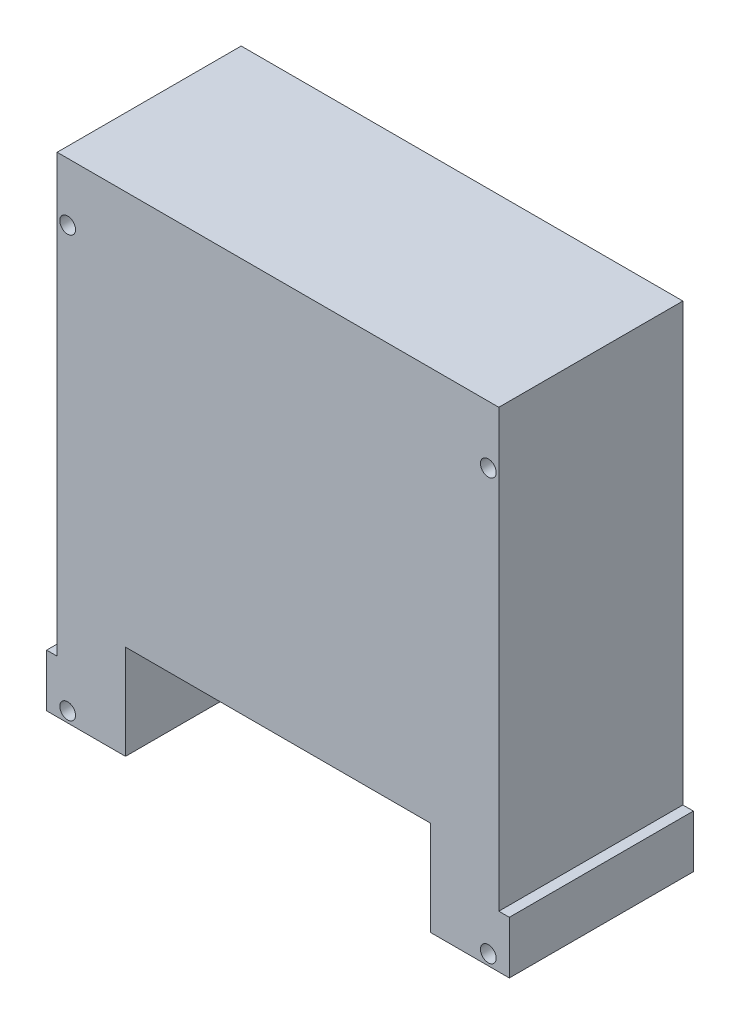
ISO-10303-21;
HEADER;
FILE_DESCRIPTION(('STEP AP214'),'2;1');
FILE_NAME('part.step','',(''),(''),'','','');
FILE_SCHEMA(('AUTOMOTIVE_DESIGN { 1 0 10303 214 1 1 1 1 }'));
ENDSEC;
DATA;
#1=APPLICATION_CONTEXT('core data for automotive mechanical design processes');
#2=APPLICATION_PROTOCOL_DEFINITION('international standard','automotive_design',2000,#1);
#3=PRODUCT_CONTEXT('',#1,'mechanical');
#4=PRODUCT('Part','Part','',(#3));
#5=PRODUCT_RELATED_PRODUCT_CATEGORY('part','',(#4));
#6=PRODUCT_DEFINITION_FORMATION('','',#4);
#7=PRODUCT_DEFINITION_CONTEXT('part definition',#1,'design');
#8=PRODUCT_DEFINITION('design','',#6,#7);
#9=PRODUCT_DEFINITION_SHAPE('','',#8);
#10=(LENGTH_UNIT() NAMED_UNIT(*) SI_UNIT(.MILLI.,.METRE.));
#11=(NAMED_UNIT(*) PLANE_ANGLE_UNIT() SI_UNIT($,.RADIAN.));
#12=(NAMED_UNIT(*) SI_UNIT($,.STERADIAN.) SOLID_ANGLE_UNIT());
#13=UNCERTAINTY_MEASURE_WITH_UNIT(LENGTH_MEASURE(1.E-05),#10,'distance_accuracy_value','');
#14=(GEOMETRIC_REPRESENTATION_CONTEXT(3) GLOBAL_UNCERTAINTY_ASSIGNED_CONTEXT((#13)) GLOBAL_UNIT_ASSIGNED_CONTEXT((#10,
#11,#12)) REPRESENTATION_CONTEXT('',''));
#15=CARTESIAN_POINT('',(0.,0.,0.));
#16=DIRECTION('',(0.,0.,1.));
#17=DIRECTION('',(1.,0.,0.));
#18=AXIS2_PLACEMENT_3D('',#15,#16,#17);
#19=CARTESIAN_POINT('',(84.,0.,35.));
#20=DIRECTION('',(-1.,0.,0.));
#21=DIRECTION('',(0.,-1.,0.));
#22=AXIS2_PLACEMENT_3D('',#19,#20,#21);
#23=PLANE('',#22);
#24=DIRECTION('',(0.,0.,1.));
#25=VECTOR('',#24,1.);
#26=CARTESIAN_POINT('',(84.,9.99999999999999,35.));
#27=LINE('',#26,#25);
#28=CARTESIAN_POINT('',(84.,9.99999999999998,0.));
#29=VERTEX_POINT('',#28);
#30=CARTESIAN_POINT('',(84.,9.99999999999999,35.));
#31=VERTEX_POINT('',#30);
#32=EDGE_CURVE('E56',#29,#31,#27,.T.);
#33=ORIENTED_EDGE('',*,*,#32,.F.);
#34=DIRECTION('',(0.,1.,0.));
#35=VECTOR('',#34,1.);
#36=CARTESIAN_POINT('',(84.,0.,0.));
#37=LINE('',#36,#35);
#38=CARTESIAN_POINT('',(84.,93.,0.));
#39=VERTEX_POINT('',#38);
#40=EDGE_CURVE('E233',#29,#39,#37,.T.);
#41=ORIENTED_EDGE('',*,*,#40,.T.);
#42=DIRECTION('',(0.,0.,-1.));
#43=VECTOR('',#42,1.);
#44=CARTESIAN_POINT('',(84.,93.,35.));
#45=LINE('',#44,#43);
#46=CARTESIAN_POINT('',(84.,93.,35.));
#47=VERTEX_POINT('',#46);
#48=EDGE_CURVE('E11',#47,#39,#45,.T.);
#49=ORIENTED_EDGE('',*,*,#48,.F.);
#50=DIRECTION('',(0.,1.,0.));
#51=VECTOR('',#50,1.);
#52=CARTESIAN_POINT('',(84.,0.,35.));
#53=LINE('',#52,#51);
#54=EDGE_CURVE('E223',#31,#47,#53,.T.);
#55=ORIENTED_EDGE('',*,*,#54,.F.);
#56=EDGE_LOOP('',(#33,#41,#49,#55));
#57=FACE_BOUND('',#56,.T.);
#58=ADVANCED_FACE('F33',(#57),#23,.F.);
#59=CARTESIAN_POINT('',(0.,0.,35.));
#60=DIRECTION('',(0.,1.,0.));
#61=DIRECTION('',(-1.,0.,0.));
#62=AXIS2_PLACEMENT_3D('',#59,#60,#61);
#63=PLANE('',#62);
#64=DIRECTION('',(1.,0.,0.));
#65=VECTOR('',#64,1.);
#66=CARTESIAN_POINT('',(0.,0.,0.));
#67=LINE('',#66,#65);
#68=CARTESIAN_POINT('',(-1.99999999999999,0.,0.));
#69=VERTEX_POINT('',#68);
#70=CARTESIAN_POINT('',(13.,0.,0.));
#71=VERTEX_POINT('',#70);
#72=EDGE_CURVE('E230',#69,#71,#67,.T.);
#73=ORIENTED_EDGE('',*,*,#72,.T.);
#74=DIRECTION('',(0.,0.,1.));
#75=VECTOR('',#74,1.);
#76=CARTESIAN_POINT('',(13.,0.,-0.001000000000001));
#77=LINE('',#76,#75);
#78=CARTESIAN_POINT('',(13.,0.,35.));
#79=VERTEX_POINT('',#78);
#80=EDGE_CURVE('E184',#71,#79,#77,.T.);
#81=ORIENTED_EDGE('',*,*,#80,.T.);
#82=DIRECTION('',(1.,0.,0.));
#83=VECTOR('',#82,1.);
#84=CARTESIAN_POINT('',(0.,0.,35.));
#85=LINE('',#84,#83);
#86=CARTESIAN_POINT('',(-1.99999999999999,0.,35.));
#87=VERTEX_POINT('',#86);
#88=EDGE_CURVE('E221',#87,#79,#85,.T.);
#89=ORIENTED_EDGE('',*,*,#88,.F.);
#90=DIRECTION('',(0.,0.,-1.));
#91=VECTOR('',#90,1.);
#92=CARTESIAN_POINT('',(-1.99999999999999,0.,35.));
#93=LINE('',#92,#91);
#94=EDGE_CURVE('E139',#87,#69,#93,.T.);
#95=ORIENTED_EDGE('',*,*,#94,.T.);
#96=EDGE_LOOP('',(#73,#81,#89,#95));
#97=FACE_BOUND('',#96,.T.);
#98=ADVANCED_FACE('F246',(#97),#63,.F.);
#99=CARTESIAN_POINT('',(0.,0.,35.));
#100=DIRECTION('',(1.,0.,0.));
#101=DIRECTION('',(0.,1.,0.));
#102=AXIS2_PLACEMENT_3D('',#99,#100,#101);
#103=PLANE('',#102);
#104=DIRECTION('',(0.,-1.,0.));
#105=VECTOR('',#104,1.);
#106=CARTESIAN_POINT('',(0.,0.,0.));
#107=LINE('',#106,#105);
#108=CARTESIAN_POINT('',(0.,93.,0.));
#109=VERTEX_POINT('',#108);
#110=CARTESIAN_POINT('',(0.,9.99999999999996,0.));
#111=VERTEX_POINT('',#110);
#112=EDGE_CURVE('E215',#109,#111,#107,.T.);
#113=ORIENTED_EDGE('',*,*,#112,.T.);
#114=DIRECTION('',(0.,0.,1.));
#115=VECTOR('',#114,1.);
#116=CARTESIAN_POINT('',(0.,9.99999999999996,35.));
#117=LINE('',#116,#115);
#118=CARTESIAN_POINT('',(0.,9.99999999999996,35.));
#119=VERTEX_POINT('',#118);
#120=EDGE_CURVE('E140',#111,#119,#117,.T.);
#121=ORIENTED_EDGE('',*,*,#120,.T.);
#122=DIRECTION('',(0.,-1.,0.));
#123=VECTOR('',#122,1.);
#124=CARTESIAN_POINT('',(0.,0.,35.));
#125=LINE('',#124,#123);
#126=CARTESIAN_POINT('',(0.,93.,35.));
#127=VERTEX_POINT('',#126);
#128=EDGE_CURVE('E129',#127,#119,#125,.T.);
#129=ORIENTED_EDGE('',*,*,#128,.F.);
#130=DIRECTION('',(0.,0.,-1.));
#131=VECTOR('',#130,1.);
#132=CARTESIAN_POINT('',(0.,93.,35.));
#133=LINE('',#132,#131);
#134=EDGE_CURVE('E41',#127,#109,#133,.T.);
#135=ORIENTED_EDGE('',*,*,#134,.T.);
#136=EDGE_LOOP('',(#113,#121,#129,#135));
#137=FACE_BOUND('',#136,.T.);
#138=ADVANCED_FACE('F35',(#137),#103,.F.);
#139=CARTESIAN_POINT('',(71.,0.,35.));
#140=VERTEX_POINT('',#139);
#141=CARTESIAN_POINT('',(86.,0.,35.));
#142=VERTEX_POINT('',#141);
#143=EDGE_CURVE('E219',#140,#142,#85,.T.);
#144=ORIENTED_EDGE('',*,*,#143,.F.);
#145=DIRECTION('',(0.,0.,1.));
#146=VECTOR('',#145,1.);
#147=CARTESIAN_POINT('',(71.,0.,-0.001000000000001));
#148=LINE('',#147,#146);
#149=CARTESIAN_POINT('',(71.,0.,0.));
#150=VERTEX_POINT('',#149);
#151=EDGE_CURVE('E190',#150,#140,#148,.T.);
#152=ORIENTED_EDGE('',*,*,#151,.F.);
#153=CARTESIAN_POINT('',(86.,0.,0.));
#154=VERTEX_POINT('',#153);
#155=EDGE_CURVE('E229',#150,#154,#67,.T.);
#156=ORIENTED_EDGE('',*,*,#155,.T.);
#157=DIRECTION('',(0.,0.,-1.));
#158=VECTOR('',#157,1.);
#159=CARTESIAN_POINT('',(86.,0.,35.));
#160=LINE('',#159,#158);
#161=EDGE_CURVE('E153',#142,#154,#160,.T.);
#162=ORIENTED_EDGE('',*,*,#161,.F.);
#163=EDGE_LOOP('',(#144,#152,#156,#162));
#164=FACE_BOUND('',#163,.T.);
#165=ADVANCED_FACE('F263',(#164),#63,.F.);
#166=CARTESIAN_POINT('',(0.,93.,35.));
#167=DIRECTION('',(0.,-1.,0.));
#168=DIRECTION('',(1.,0.,0.));
#169=AXIS2_PLACEMENT_3D('',#166,#167,#168);
#170=PLANE('',#169);
#171=DIRECTION('',(-1.,0.,0.));
#172=VECTOR('',#171,1.);
#173=CARTESIAN_POINT('',(0.,93.,0.));
#174=LINE('',#173,#172);
#175=EDGE_CURVE('E220',#39,#109,#174,.T.);
#176=ORIENTED_EDGE('',*,*,#175,.T.);
#177=ORIENTED_EDGE('',*,*,#134,.F.);
#178=DIRECTION('',(-1.,0.,0.));
#179=VECTOR('',#178,1.);
#180=CARTESIAN_POINT('',(0.,93.,35.));
#181=LINE('',#180,#179);
#182=EDGE_CURVE('E225',#47,#127,#181,.T.);
#183=ORIENTED_EDGE('',*,*,#182,.F.);
#184=ORIENTED_EDGE('',*,*,#48,.T.);
#185=EDGE_LOOP('',(#176,#177,#183,#184));
#186=FACE_BOUND('',#185,.T.);
#187=ADVANCED_FACE('F274',(#186),#170,.F.);
#188=CARTESIAN_POINT('',(0.,0.,35.));
#189=DIRECTION('',(0.,0.,-1.));
#190=DIRECTION('',(-1.,0.,0.));
#191=AXIS2_PLACEMENT_3D('',#188,#189,#190);
#192=PLANE('',#191);
#193=CARTESIAN_POINT('',(1.99999999999999,82.,35.));
#194=DIRECTION('',(0.,0.,1.));
#195=DIRECTION('',(1.,0.,0.));
#196=AXIS2_PLACEMENT_3D('',#193,#194,#195);
#197=CIRCLE('',#196,1.5);
#198=CARTESIAN_POINT('',(3.49999999999999,82.,35.));
#199=VERTEX_POINT('',#198);
#200=EDGE_CURVE('E207',#199,#199,#197,.T.);
#201=ORIENTED_EDGE('',*,*,#200,.F.);
#202=EDGE_LOOP('',(#201));
#203=FACE_BOUND('',#202,.T.);
#204=CARTESIAN_POINT('',(1.99999999999999,2.00000000000002,35.));
#205=DIRECTION('',(0.,0.,1.));
#206=DIRECTION('',(1.,0.,0.));
#207=AXIS2_PLACEMENT_3D('',#204,#205,#206);
#208=CIRCLE('',#207,1.5);
#209=CARTESIAN_POINT('',(3.5,2.00000000000002,35.));
#210=VERTEX_POINT('',#209);
#211=EDGE_CURVE('E201',#210,#210,#208,.T.);
#212=ORIENTED_EDGE('',*,*,#211,.F.);
#213=EDGE_LOOP('',(#212));
#214=FACE_BOUND('',#213,.T.);
#215=CARTESIAN_POINT('',(82.,2.00000000000002,35.));
#216=DIRECTION('',(0.,0.,1.));
#217=DIRECTION('',(1.,0.,0.));
#218=AXIS2_PLACEMENT_3D('',#215,#216,#217);
#219=CIRCLE('',#218,1.5);
#220=CARTESIAN_POINT('',(83.5,2.00000000000002,35.));
#221=VERTEX_POINT('',#220);
#222=EDGE_CURVE('E194',#221,#221,#219,.T.);
#223=ORIENTED_EDGE('',*,*,#222,.F.);
#224=EDGE_LOOP('',(#223));
#225=FACE_BOUND('',#224,.T.);
#226=CARTESIAN_POINT('',(82.,82.,35.));
#227=DIRECTION('',(0.,0.,1.));
#228=DIRECTION('',(1.,0.,0.));
#229=AXIS2_PLACEMENT_3D('',#226,#227,#228);
#230=CIRCLE('',#229,1.5);
#231=CARTESIAN_POINT('',(83.5,82.,35.));
#232=VERTEX_POINT('',#231);
#233=EDGE_CURVE('E212',#232,#232,#230,.T.);
#234=ORIENTED_EDGE('',*,*,#233,.F.);
#235=EDGE_LOOP('',(#234));
#236=FACE_BOUND('',#235,.T.);
#237=ORIENTED_EDGE('',*,*,#88,.T.);
#238=DIRECTION('',(0.,-1.,0.));
#239=VECTOR('',#238,1.);
#240=CARTESIAN_POINT('',(13.,0.,35.));
#241=LINE('',#240,#239);
#242=CARTESIAN_POINT('',(13.,18.,35.));
#243=VERTEX_POINT('',#242);
#244=EDGE_CURVE('E176',#243,#79,#241,.T.);
#245=ORIENTED_EDGE('',*,*,#244,.F.);
#246=DIRECTION('',(-1.,0.,0.));
#247=VECTOR('',#246,1.);
#248=CARTESIAN_POINT('',(13.,18.,35.));
#249=LINE('',#248,#247);
#250=CARTESIAN_POINT('',(71.,18.,35.));
#251=VERTEX_POINT('',#250);
#252=EDGE_CURVE('E181',#251,#243,#249,.T.);
#253=ORIENTED_EDGE('',*,*,#252,.F.);
#254=DIRECTION('',(0.,1.,0.));
#255=VECTOR('',#254,1.);
#256=CARTESIAN_POINT('',(71.,0.,35.));
#257=LINE('',#256,#255);
#258=EDGE_CURVE('E178',#140,#251,#257,.T.);
#259=ORIENTED_EDGE('',*,*,#258,.F.);
#260=ORIENTED_EDGE('',*,*,#143,.T.);
#261=DIRECTION('',(0.,-1.,0.));
#262=VECTOR('',#261,1.);
#263=CARTESIAN_POINT('',(86.,9.99999999999999,35.));
#264=LINE('',#263,#262);
#265=CARTESIAN_POINT('',(86.,9.99999999999999,35.));
#266=VERTEX_POINT('',#265);
#267=EDGE_CURVE('E150',#266,#142,#264,.T.);
#268=ORIENTED_EDGE('',*,*,#267,.F.);
#269=DIRECTION('',(-1.,0.,0.));
#270=VECTOR('',#269,1.);
#271=CARTESIAN_POINT('',(86.,9.99999999999999,35.));
#272=LINE('',#271,#270);
#273=EDGE_CURVE('E160',#266,#31,#272,.T.);
#274=ORIENTED_EDGE('',*,*,#273,.T.);
#275=ORIENTED_EDGE('',*,*,#54,.T.);
#276=ORIENTED_EDGE('',*,*,#182,.T.);
#277=ORIENTED_EDGE('',*,*,#128,.T.);
#278=DIRECTION('',(1.,0.,0.));
#279=VECTOR('',#278,1.);
#280=CARTESIAN_POINT('',(-1.99999999999999,9.99999999999996,35.));
#281=LINE('',#280,#279);
#282=CARTESIAN_POINT('',(-1.99999999999999,9.99999999999996,35.));
#283=VERTEX_POINT('',#282);
#284=EDGE_CURVE('E48',#283,#119,#281,.T.);
#285=ORIENTED_EDGE('',*,*,#284,.F.);
#286=DIRECTION('',(0.,-1.,0.));
#287=VECTOR('',#286,1.);
#288=CARTESIAN_POINT('',(-1.99999999999999,9.99999999999996,35.));
#289=LINE('',#288,#287);
#290=EDGE_CURVE('E126',#283,#87,#289,.T.);
#291=ORIENTED_EDGE('',*,*,#290,.T.);
#292=EDGE_LOOP('',(#237,#245,#253,#259,#260,#268,#274,#275,#276,#277,#285,#291));
#293=FACE_BOUND('',#292,.T.);
#294=ADVANCED_FACE('F125',(#203,#214,#225,#236,#293),#192,.F.);
#295=CARTESIAN_POINT('',(0.,0.,0.));
#296=DIRECTION('',(0.,0.,-1.));
#297=DIRECTION('',(-1.,0.,0.));
#298=AXIS2_PLACEMENT_3D('',#295,#296,#297);
#299=PLANE('',#298);
#300=DIRECTION('',(0.,-1.,0.));
#301=VECTOR('',#300,1.);
#302=CARTESIAN_POINT('',(13.,0.,0.));
#303=LINE('',#302,#301);
#304=CARTESIAN_POINT('',(13.,18.,0.));
#305=VERTEX_POINT('',#304);
#306=EDGE_CURVE('E173',#305,#71,#303,.T.);
#307=ORIENTED_EDGE('',*,*,#306,.T.);
#308=ORIENTED_EDGE('',*,*,#72,.F.);
#309=DIRECTION('',(0.,1.,0.));
#310=VECTOR('',#309,1.);
#311=CARTESIAN_POINT('',(-1.99999999999999,9.99999999999996,0.));
#312=LINE('',#311,#310);
#313=CARTESIAN_POINT('',(-1.99999999999999,9.99999999999996,0.));
#314=VERTEX_POINT('',#313);
#315=EDGE_CURVE('E143',#69,#314,#312,.T.);
#316=ORIENTED_EDGE('',*,*,#315,.T.);
#317=DIRECTION('',(1.,0.,0.));
#318=VECTOR('',#317,1.);
#319=CARTESIAN_POINT('',(-1.99999999999999,9.99999999999996,0.));
#320=LINE('',#319,#318);
#321=EDGE_CURVE('E130',#314,#111,#320,.T.);
#322=ORIENTED_EDGE('',*,*,#321,.T.);
#323=ORIENTED_EDGE('',*,*,#112,.F.);
#324=ORIENTED_EDGE('',*,*,#175,.F.);
#325=ORIENTED_EDGE('',*,*,#40,.F.);
#326=DIRECTION('',(-1.,0.,0.));
#327=VECTOR('',#326,1.);
#328=CARTESIAN_POINT('',(86.,9.99999999999999,0.));
#329=LINE('',#328,#327);
#330=CARTESIAN_POINT('',(86.,9.99999999999999,0.));
#331=VERTEX_POINT('',#330);
#332=EDGE_CURVE('E164',#331,#29,#329,.T.);
#333=ORIENTED_EDGE('',*,*,#332,.F.);
#334=DIRECTION('',(0.,1.,0.));
#335=VECTOR('',#334,1.);
#336=CARTESIAN_POINT('',(86.,9.99999999999999,0.));
#337=LINE('',#336,#335);
#338=EDGE_CURVE('E156',#154,#331,#337,.T.);
#339=ORIENTED_EDGE('',*,*,#338,.F.);
#340=ORIENTED_EDGE('',*,*,#155,.F.);
#341=DIRECTION('',(0.,1.,0.));
#342=VECTOR('',#341,1.);
#343=CARTESIAN_POINT('',(71.,0.,0.));
#344=LINE('',#343,#342);
#345=CARTESIAN_POINT('',(71.,18.,0.));
#346=VERTEX_POINT('',#345);
#347=EDGE_CURVE('E167',#150,#346,#344,.T.);
#348=ORIENTED_EDGE('',*,*,#347,.T.);
#349=DIRECTION('',(-1.,0.,0.));
#350=VECTOR('',#349,1.);
#351=CARTESIAN_POINT('',(13.,18.,0.));
#352=LINE('',#351,#350);
#353=EDGE_CURVE('E170',#346,#305,#352,.T.);
#354=ORIENTED_EDGE('',*,*,#353,.T.);
#355=EDGE_LOOP('',(#307,#308,#316,#322,#323,#324,#325,#333,#339,#340,#348,#354));
#356=FACE_BOUND('',#355,.T.);
#357=CARTESIAN_POINT('',(1.99999999999999,82.,0.));
#358=DIRECTION('',(0.,0.,-1.));
#359=DIRECTION('',(-1.,0.,0.));
#360=AXIS2_PLACEMENT_3D('',#357,#358,#359);
#361=CIRCLE('',#360,1.5);
#362=CARTESIAN_POINT('',(0.499999999999986,82.,0.));
#363=VERTEX_POINT('',#362);
#364=EDGE_CURVE('E187',#363,#363,#361,.F.);
#365=ORIENTED_EDGE('',*,*,#364,.T.);
#366=EDGE_LOOP('',(#365));
#367=FACE_BOUND('',#366,.T.);
#368=CARTESIAN_POINT('',(1.99999999999999,2.00000000000002,0.));
#369=DIRECTION('',(0.,0.,-1.));
#370=DIRECTION('',(-1.,0.,0.));
#371=AXIS2_PLACEMENT_3D('',#368,#369,#370);
#372=CIRCLE('',#371,1.5);
#373=CARTESIAN_POINT('',(0.499999999999994,2.00000000000002,0.));
#374=VERTEX_POINT('',#373);
#375=EDGE_CURVE('E204',#374,#374,#372,.F.);
#376=ORIENTED_EDGE('',*,*,#375,.T.);
#377=EDGE_LOOP('',(#376));
#378=FACE_BOUND('',#377,.T.);
#379=CARTESIAN_POINT('',(82.,2.00000000000002,0.));
#380=DIRECTION('',(0.,0.,-1.));
#381=DIRECTION('',(-1.,0.,0.));
#382=AXIS2_PLACEMENT_3D('',#379,#380,#381);
#383=CIRCLE('',#382,1.5);
#384=CARTESIAN_POINT('',(80.5,2.00000000000002,0.));
#385=VERTEX_POINT('',#384);
#386=EDGE_CURVE('E198',#385,#385,#383,.F.);
#387=ORIENTED_EDGE('',*,*,#386,.T.);
#388=EDGE_LOOP('',(#387));
#389=FACE_BOUND('',#388,.T.);
#390=CARTESIAN_POINT('',(82.,82.,0.));
#391=DIRECTION('',(0.,0.,-1.));
#392=DIRECTION('',(-1.,0.,0.));
#393=AXIS2_PLACEMENT_3D('',#390,#391,#392);
#394=CIRCLE('',#393,1.5);
#395=CARTESIAN_POINT('',(80.5,82.,0.));
#396=VERTEX_POINT('',#395);
#397=EDGE_CURVE('E197',#396,#396,#394,.F.);
#398=ORIENTED_EDGE('',*,*,#397,.T.);
#399=EDGE_LOOP('',(#398));
#400=FACE_BOUND('',#399,.T.);
#401=ADVANCED_FACE('F243',(#356,#367,#378,#389,#400),#299,.T.);
#402=CARTESIAN_POINT('',(82.,82.,-0.001000000000001));
#403=DIRECTION('',(0.,0.,1.));
#404=DIRECTION('',(1.,0.,0.));
#405=AXIS2_PLACEMENT_3D('',#402,#403,#404);
#406=CYLINDRICAL_SURFACE('',#405,1.5);
#407=ORIENTED_EDGE('',*,*,#397,.F.);
#408=EDGE_LOOP('',(#407));
#409=FACE_BOUND('',#408,.T.);
#410=ORIENTED_EDGE('',*,*,#233,.T.);
#411=EDGE_LOOP('',(#410));
#412=FACE_BOUND('',#411,.T.);
#413=ADVANCED_FACE('F349',(#409,#412),#406,.F.);
#414=CARTESIAN_POINT('',(82.,2.00000000000002,-0.001000000000001));
#415=DIRECTION('',(0.,0.,1.));
#416=DIRECTION('',(1.,0.,0.));
#417=AXIS2_PLACEMENT_3D('',#414,#415,#416);
#418=CYLINDRICAL_SURFACE('',#417,1.5);
#419=ORIENTED_EDGE('',*,*,#386,.F.);
#420=EDGE_LOOP('',(#419));
#421=FACE_BOUND('',#420,.T.);
#422=ORIENTED_EDGE('',*,*,#222,.T.);
#423=EDGE_LOOP('',(#422));
#424=FACE_BOUND('',#423,.T.);
#425=ADVANCED_FACE('F375',(#421,#424),#418,.F.);
#426=CARTESIAN_POINT('',(1.99999999999999,2.00000000000002,-0.001000000000001));
#427=DIRECTION('',(0.,0.,1.));
#428=DIRECTION('',(1.,0.,0.));
#429=AXIS2_PLACEMENT_3D('',#426,#427,#428);
#430=CYLINDRICAL_SURFACE('',#429,1.5);
#431=ORIENTED_EDGE('',*,*,#375,.F.);
#432=EDGE_LOOP('',(#431));
#433=FACE_BOUND('',#432,.T.);
#434=ORIENTED_EDGE('',*,*,#211,.T.);
#435=EDGE_LOOP('',(#434));
#436=FACE_BOUND('',#435,.T.);
#437=ADVANCED_FACE('F378',(#433,#436),#430,.F.);
#438=CARTESIAN_POINT('',(1.99999999999999,82.,-0.001000000000001));
#439=DIRECTION('',(0.,0.,1.));
#440=DIRECTION('',(1.,0.,0.));
#441=AXIS2_PLACEMENT_3D('',#438,#439,#440);
#442=CYLINDRICAL_SURFACE('',#441,1.5);
#443=ORIENTED_EDGE('',*,*,#364,.F.);
#444=EDGE_LOOP('',(#443));
#445=FACE_BOUND('',#444,.T.);
#446=ORIENTED_EDGE('',*,*,#200,.T.);
#447=EDGE_LOOP('',(#446));
#448=FACE_BOUND('',#447,.T.);
#449=ADVANCED_FACE('F374',(#445,#448),#442,.F.);
#450=CARTESIAN_POINT('',(13.,0.,-0.001000000000001));
#451=DIRECTION('',(-1.,0.,0.));
#452=DIRECTION('',(0.,-1.,0.));
#453=AXIS2_PLACEMENT_3D('',#450,#451,#452);
#454=PLANE('',#453);
#455=DIRECTION('',(0.,0.,1.));
#456=VECTOR('',#455,1.);
#457=CARTESIAN_POINT('',(13.,18.,-0.001000000000001));
#458=LINE('',#457,#456);
#459=EDGE_CURVE('E185',#305,#243,#458,.T.);
#460=ORIENTED_EDGE('',*,*,#459,.T.);
#461=ORIENTED_EDGE('',*,*,#244,.T.);
#462=ORIENTED_EDGE('',*,*,#80,.F.);
#463=ORIENTED_EDGE('',*,*,#306,.F.);
#464=EDGE_LOOP('',(#460,#461,#462,#463));
#465=FACE_BOUND('',#464,.T.);
#466=ADVANCED_FACE('F251',(#465),#454,.F.);
#467=CARTESIAN_POINT('',(13.,18.,-0.001000000000001));
#468=DIRECTION('',(0.,1.,0.));
#469=DIRECTION('',(-1.,0.,0.));
#470=AXIS2_PLACEMENT_3D('',#467,#468,#469);
#471=PLANE('',#470);
#472=DIRECTION('',(0.,0.,1.));
#473=VECTOR('',#472,1.);
#474=CARTESIAN_POINT('',(71.,18.,-0.001000000000001));
#475=LINE('',#474,#473);
#476=EDGE_CURVE('E188',#346,#251,#475,.T.);
#477=ORIENTED_EDGE('',*,*,#476,.T.);
#478=ORIENTED_EDGE('',*,*,#252,.T.);
#479=ORIENTED_EDGE('',*,*,#459,.F.);
#480=ORIENTED_EDGE('',*,*,#353,.F.);
#481=EDGE_LOOP('',(#477,#478,#479,#480));
#482=FACE_BOUND('',#481,.T.);
#483=ADVANCED_FACE('F255',(#482),#471,.F.);
#484=CARTESIAN_POINT('',(71.,0.,-0.001000000000001));
#485=DIRECTION('',(1.,0.,0.));
#486=DIRECTION('',(0.,1.,0.));
#487=AXIS2_PLACEMENT_3D('',#484,#485,#486);
#488=PLANE('',#487);
#489=ORIENTED_EDGE('',*,*,#151,.T.);
#490=ORIENTED_EDGE('',*,*,#258,.T.);
#491=ORIENTED_EDGE('',*,*,#476,.F.);
#492=ORIENTED_EDGE('',*,*,#347,.F.);
#493=EDGE_LOOP('',(#489,#490,#491,#492));
#494=FACE_BOUND('',#493,.T.);
#495=ADVANCED_FACE('F257',(#494),#488,.F.);
#496=CARTESIAN_POINT('',(86.,9.99999999999999,35.));
#497=DIRECTION('',(0.,-1.,0.));
#498=DIRECTION('',(1.,0.,0.));
#499=AXIS2_PLACEMENT_3D('',#496,#497,#498);
#500=PLANE('',#499);
#501=ORIENTED_EDGE('',*,*,#32,.T.);
#502=ORIENTED_EDGE('',*,*,#273,.F.);
#503=DIRECTION('',(0.,0.,1.));
#504=VECTOR('',#503,1.);
#505=CARTESIAN_POINT('',(86.,9.99999999999999,35.));
#506=LINE('',#505,#504);
#507=EDGE_CURVE('E158',#331,#266,#506,.T.);
#508=ORIENTED_EDGE('',*,*,#507,.F.);
#509=ORIENTED_EDGE('',*,*,#332,.T.);
#510=EDGE_LOOP('',(#501,#502,#508,#509));
#511=FACE_BOUND('',#510,.T.);
#512=ADVANCED_FACE('F272',(#511),#500,.F.);
#513=CARTESIAN_POINT('',(86.,0.,0.));
#514=DIRECTION('',(1.,0.,0.));
#515=DIRECTION('',(0.,0.,-1.));
#516=AXIS2_PLACEMENT_3D('',#513,#514,#515);
#517=PLANE('',#516);
#518=ORIENTED_EDGE('',*,*,#267,.T.);
#519=ORIENTED_EDGE('',*,*,#161,.T.);
#520=ORIENTED_EDGE('',*,*,#338,.T.);
#521=ORIENTED_EDGE('',*,*,#507,.T.);
#522=EDGE_LOOP('',(#518,#519,#520,#521));
#523=FACE_BOUND('',#522,.T.);
#524=ADVANCED_FACE('F267',(#523),#517,.T.);
#525=CARTESIAN_POINT('',(-1.99999999999999,9.99999999999996,35.));
#526=DIRECTION('',(0.,1.,0.));
#527=DIRECTION('',(-1.,0.,0.));
#528=AXIS2_PLACEMENT_3D('',#525,#526,#527);
#529=PLANE('',#528);
#530=ORIENTED_EDGE('',*,*,#120,.F.);
#531=ORIENTED_EDGE('',*,*,#321,.F.);
#532=DIRECTION('',(0.,0.,1.));
#533=VECTOR('',#532,1.);
#534=CARTESIAN_POINT('',(-1.99999999999999,9.99999999999996,35.));
#535=LINE('',#534,#533);
#536=EDGE_CURVE('E136',#314,#283,#535,.T.);
#537=ORIENTED_EDGE('',*,*,#536,.T.);
#538=ORIENTED_EDGE('',*,*,#284,.T.);
#539=EDGE_LOOP('',(#530,#531,#537,#538));
#540=FACE_BOUND('',#539,.T.);
#541=ADVANCED_FACE('F142',(#540),#529,.T.);
#542=CARTESIAN_POINT('',(-1.99999999999999,0.,0.));
#543=DIRECTION('',(-1.,0.,0.));
#544=DIRECTION('',(0.,0.,-1.));
#545=AXIS2_PLACEMENT_3D('',#542,#543,#544);
#546=PLANE('',#545);
#547=ORIENTED_EDGE('',*,*,#290,.F.);
#548=ORIENTED_EDGE('',*,*,#536,.F.);
#549=ORIENTED_EDGE('',*,*,#315,.F.);
#550=ORIENTED_EDGE('',*,*,#94,.F.);
#551=EDGE_LOOP('',(#547,#548,#549,#550));
#552=FACE_BOUND('',#551,.T.);
#553=ADVANCED_FACE('F134',(#552),#546,.T.);
#554=CLOSED_SHELL('',(#58,#98,#138,#165,#187,#294,#401,#413,#425,#437,#449,#466,#483,#495,#512,
#524,#541,#553));
#555=MANIFOLD_SOLID_BREP('B2',#554);
#556=ADVANCED_BREP_SHAPE_REPRESENTATION('',(#18,#555),#14);
#557=SHAPE_DEFINITION_REPRESENTATION(#9,#556);
ENDSEC;
END-ISO-10303-21;
